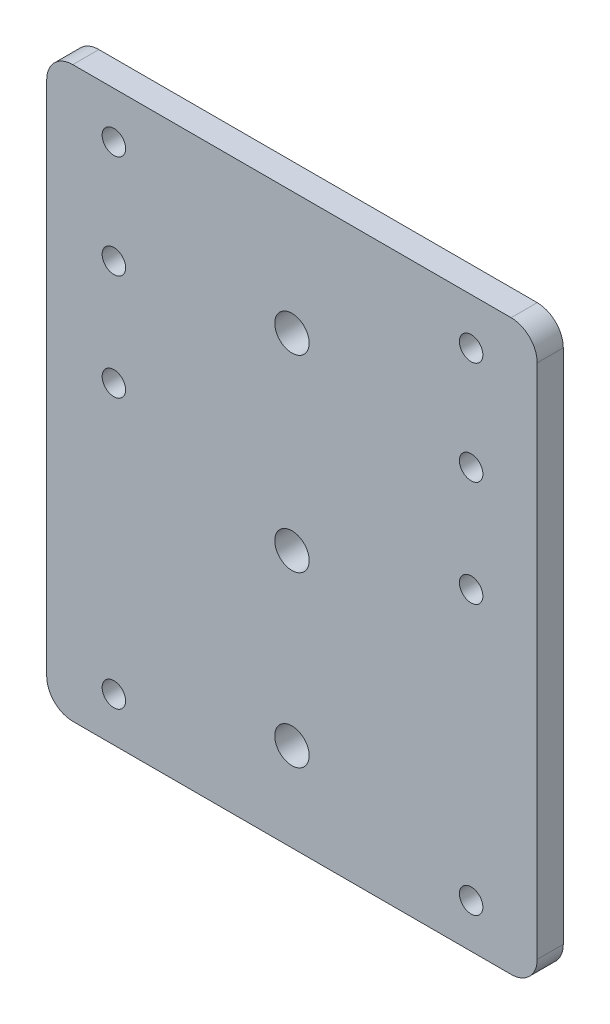
ISO-10303-21;
HEADER;
FILE_DESCRIPTION(('STEP AP214'),'2;1');
FILE_NAME('part.step','',(''),(''),'','','');
FILE_SCHEMA(('AUTOMOTIVE_DESIGN { 1 0 10303 214 1 1 1 1 }'));
ENDSEC;
DATA;
#1=APPLICATION_CONTEXT('core data for automotive mechanical design processes');
#2=APPLICATION_PROTOCOL_DEFINITION('international standard','automotive_design',2000,#1);
#3=PRODUCT_CONTEXT('',#1,'mechanical');
#4=PRODUCT('Part','Part','',(#3));
#5=PRODUCT_RELATED_PRODUCT_CATEGORY('part','',(#4));
#6=PRODUCT_DEFINITION_FORMATION('','',#4);
#7=PRODUCT_DEFINITION_CONTEXT('part definition',#1,'design');
#8=PRODUCT_DEFINITION('design','',#6,#7);
#9=PRODUCT_DEFINITION_SHAPE('','',#8);
#10=(LENGTH_UNIT() NAMED_UNIT(*) SI_UNIT(.MILLI.,.METRE.));
#11=(NAMED_UNIT(*) PLANE_ANGLE_UNIT() SI_UNIT($,.RADIAN.));
#12=(NAMED_UNIT(*) SI_UNIT($,.STERADIAN.) SOLID_ANGLE_UNIT());
#13=UNCERTAINTY_MEASURE_WITH_UNIT(LENGTH_MEASURE(1.E-05),#10,'distance_accuracy_value','');
#14=(GEOMETRIC_REPRESENTATION_CONTEXT(3) GLOBAL_UNCERTAINTY_ASSIGNED_CONTEXT((#13)) GLOBAL_UNIT_ASSIGNED_CONTEXT((#10,
#11,#12)) REPRESENTATION_CONTEXT('',''));
#15=CARTESIAN_POINT('',(0.,0.,0.));
#16=DIRECTION('',(0.,0.,1.));
#17=DIRECTION('',(1.,0.,0.));
#18=AXIS2_PLACEMENT_3D('',#15,#16,#17);
#19=CARTESIAN_POINT('',(42.,-49.5,5.));
#20=DIRECTION('',(0.,0.,-1.));
#21=DIRECTION('',(-1.,0.,0.));
#22=AXIS2_PLACEMENT_3D('',#19,#20,#21);
#23=CYLINDRICAL_SURFACE('',#22,5.);
#24=CARTESIAN_POINT('',(42.,-49.5,0.));
#25=DIRECTION('',(0.,0.,1.));
#26=DIRECTION('',(1.,0.,0.));
#27=AXIS2_PLACEMENT_3D('',#24,#25,#26);
#28=CIRCLE('',#27,5.);
#29=CARTESIAN_POINT('',(42.,-54.5,0.));
#30=VERTEX_POINT('',#29);
#31=CARTESIAN_POINT('',(47.,-49.5,0.));
#32=VERTEX_POINT('',#31);
#33=EDGE_CURVE('E129',#30,#32,#28,.T.);
#34=ORIENTED_EDGE('',*,*,#33,.T.);
#35=DIRECTION('',(0.,0.,-1.));
#36=VECTOR('',#35,1.);
#37=CARTESIAN_POINT('',(47.,-49.5,5.));
#38=LINE('',#37,#36);
#39=CARTESIAN_POINT('',(47.,-49.5,5.));
#40=VERTEX_POINT('',#39);
#41=EDGE_CURVE('E11',#40,#32,#38,.T.);
#42=ORIENTED_EDGE('',*,*,#41,.F.);
#43=CARTESIAN_POINT('',(42.,-49.5,5.));
#44=DIRECTION('',(0.,0.,1.));
#45=DIRECTION('',(1.,0.,0.));
#46=AXIS2_PLACEMENT_3D('',#43,#44,#45);
#47=CIRCLE('',#46,5.);
#48=CARTESIAN_POINT('',(42.,-54.5,5.));
#49=VERTEX_POINT('',#48);
#50=EDGE_CURVE('E144',#49,#40,#47,.T.);
#51=ORIENTED_EDGE('',*,*,#50,.F.);
#52=DIRECTION('',(0.,0.,-1.));
#53=VECTOR('',#52,1.);
#54=CARTESIAN_POINT('',(42.,-54.5,5.));
#55=LINE('',#54,#53);
#56=EDGE_CURVE('E125',#49,#30,#55,.T.);
#57=ORIENTED_EDGE('',*,*,#56,.T.);
#58=EDGE_LOOP('',(#34,#42,#51,#57));
#59=FACE_BOUND('',#58,.T.);
#60=ADVANCED_FACE('F33',(#59),#23,.T.);
#61=CARTESIAN_POINT('',(47.,49.5,5.));
#62=DIRECTION('',(-1.,0.,0.));
#63=DIRECTION('',(0.,0.,1.));
#64=AXIS2_PLACEMENT_3D('',#61,#62,#63);
#65=PLANE('',#64);
#66=DIRECTION('',(0.,1.,0.));
#67=VECTOR('',#66,1.);
#68=CARTESIAN_POINT('',(47.,49.5,0.));
#69=LINE('',#68,#67);
#70=CARTESIAN_POINT('',(47.,49.5,0.));
#71=VERTEX_POINT('',#70);
#72=EDGE_CURVE('E132',#32,#71,#69,.T.);
#73=ORIENTED_EDGE('',*,*,#72,.T.);
#74=DIRECTION('',(0.,0.,-1.));
#75=VECTOR('',#74,1.);
#76=CARTESIAN_POINT('',(47.,49.5,5.));
#77=LINE('',#76,#75);
#78=CARTESIAN_POINT('',(47.,49.5,5.));
#79=VERTEX_POINT('',#78);
#80=EDGE_CURVE('E41',#79,#71,#77,.T.);
#81=ORIENTED_EDGE('',*,*,#80,.F.);
#82=DIRECTION('',(0.,1.,0.));
#83=VECTOR('',#82,1.);
#84=CARTESIAN_POINT('',(47.,49.5,5.));
#85=LINE('',#84,#83);
#86=EDGE_CURVE('E92',#40,#79,#85,.T.);
#87=ORIENTED_EDGE('',*,*,#86,.F.);
#88=ORIENTED_EDGE('',*,*,#41,.T.);
#89=EDGE_LOOP('',(#73,#81,#87,#88));
#90=FACE_BOUND('',#89,.T.);
#91=ADVANCED_FACE('F286',(#90),#65,.F.);
#92=CARTESIAN_POINT('',(42.,49.5,5.));
#93=DIRECTION('',(0.,0.,-1.));
#94=DIRECTION('',(-1.,0.,0.));
#95=AXIS2_PLACEMENT_3D('',#92,#93,#94);
#96=CYLINDRICAL_SURFACE('',#95,5.);
#97=CARTESIAN_POINT('',(42.,49.5,0.));
#98=DIRECTION('',(0.,0.,1.));
#99=DIRECTION('',(1.,0.,0.));
#100=AXIS2_PLACEMENT_3D('',#97,#98,#99);
#101=CIRCLE('',#100,5.);
#102=CARTESIAN_POINT('',(42.,54.5,0.));
#103=VERTEX_POINT('',#102);
#104=EDGE_CURVE('E135',#71,#103,#101,.T.);
#105=ORIENTED_EDGE('',*,*,#104,.T.);
#106=DIRECTION('',(0.,0.,-1.));
#107=VECTOR('',#106,1.);
#108=CARTESIAN_POINT('',(42.,54.5,5.));
#109=LINE('',#108,#107);
#110=CARTESIAN_POINT('',(42.,54.5,5.));
#111=VERTEX_POINT('',#110);
#112=EDGE_CURVE('E151',#111,#103,#109,.T.);
#113=ORIENTED_EDGE('',*,*,#112,.F.);
#114=CARTESIAN_POINT('',(42.,49.5,5.));
#115=DIRECTION('',(0.,0.,1.));
#116=DIRECTION('',(1.,0.,0.));
#117=AXIS2_PLACEMENT_3D('',#114,#115,#116);
#118=CIRCLE('',#117,5.);
#119=EDGE_CURVE('E159',#79,#111,#118,.T.);
#120=ORIENTED_EDGE('',*,*,#119,.F.);
#121=ORIENTED_EDGE('',*,*,#80,.T.);
#122=EDGE_LOOP('',(#105,#113,#120,#121));
#123=FACE_BOUND('',#122,.T.);
#124=ADVANCED_FACE('F157',(#123),#96,.T.);
#125=CARTESIAN_POINT('',(-42.,54.5,5.));
#126=DIRECTION('',(0.,-1.,0.));
#127=DIRECTION('',(0.,0.,-1.));
#128=AXIS2_PLACEMENT_3D('',#125,#126,#127);
#129=PLANE('',#128);
#130=DIRECTION('',(-1.,0.,0.));
#131=VECTOR('',#130,1.);
#132=CARTESIAN_POINT('',(-42.,54.5,0.));
#133=LINE('',#132,#131);
#134=CARTESIAN_POINT('',(-42.,54.5,0.));
#135=VERTEX_POINT('',#134);
#136=EDGE_CURVE('E137',#103,#135,#133,.T.);
#137=ORIENTED_EDGE('',*,*,#136,.T.);
#138=DIRECTION('',(0.,0.,-1.));
#139=VECTOR('',#138,1.);
#140=CARTESIAN_POINT('',(-42.,54.5,5.));
#141=LINE('',#140,#139);
#142=CARTESIAN_POINT('',(-42.,54.5,5.));
#143=VERTEX_POINT('',#142);
#144=EDGE_CURVE('E148',#143,#135,#141,.T.);
#145=ORIENTED_EDGE('',*,*,#144,.F.);
#146=DIRECTION('',(-1.,0.,0.));
#147=VECTOR('',#146,1.);
#148=CARTESIAN_POINT('',(-42.,54.5,5.));
#149=LINE('',#148,#147);
#150=EDGE_CURVE('E171',#111,#143,#149,.T.);
#151=ORIENTED_EDGE('',*,*,#150,.F.);
#152=ORIENTED_EDGE('',*,*,#112,.T.);
#153=EDGE_LOOP('',(#137,#145,#151,#152));
#154=FACE_BOUND('',#153,.T.);
#155=ADVANCED_FACE('F167',(#154),#129,.F.);
#156=CARTESIAN_POINT('',(-42.,49.5,5.));
#157=DIRECTION('',(0.,0.,-1.));
#158=DIRECTION('',(-1.,0.,0.));
#159=AXIS2_PLACEMENT_3D('',#156,#157,#158);
#160=CYLINDRICAL_SURFACE('',#159,5.);
#161=CARTESIAN_POINT('',(-42.,49.5,0.));
#162=DIRECTION('',(0.,0.,1.));
#163=DIRECTION('',(-1.,0.,0.));
#164=AXIS2_PLACEMENT_3D('',#161,#162,#163);
#165=CIRCLE('',#164,5.);
#166=CARTESIAN_POINT('',(-47.,49.5,0.));
#167=VERTEX_POINT('',#166);
#168=EDGE_CURVE('E139',#135,#167,#165,.T.);
#169=ORIENTED_EDGE('',*,*,#168,.T.);
#170=DIRECTION('',(0.,0.,-1.));
#171=VECTOR('',#170,1.);
#172=CARTESIAN_POINT('',(-47.,49.5,5.));
#173=LINE('',#172,#171);
#174=CARTESIAN_POINT('',(-47.,49.5,5.));
#175=VERTEX_POINT('',#174);
#176=EDGE_CURVE('E120',#175,#167,#173,.T.);
#177=ORIENTED_EDGE('',*,*,#176,.F.);
#178=CARTESIAN_POINT('',(-42.,49.5,5.));
#179=DIRECTION('',(0.,0.,1.));
#180=DIRECTION('',(-1.,0.,0.));
#181=AXIS2_PLACEMENT_3D('',#178,#179,#180);
#182=CIRCLE('',#181,5.);
#183=EDGE_CURVE('E111',#143,#175,#182,.T.);
#184=ORIENTED_EDGE('',*,*,#183,.F.);
#185=ORIENTED_EDGE('',*,*,#144,.T.);
#186=EDGE_LOOP('',(#169,#177,#184,#185));
#187=FACE_BOUND('',#186,.T.);
#188=ADVANCED_FACE('F170',(#187),#160,.T.);
#189=CARTESIAN_POINT('',(-47.,49.5,5.));
#190=DIRECTION('',(1.,0.,0.));
#191=DIRECTION('',(0.,0.,-1.));
#192=AXIS2_PLACEMENT_3D('',#189,#190,#191);
#193=PLANE('',#192);
#194=DIRECTION('',(0.,-1.,0.));
#195=VECTOR('',#194,1.);
#196=CARTESIAN_POINT('',(-47.,49.5,0.));
#197=LINE('',#196,#195);
#198=CARTESIAN_POINT('',(-47.,-49.5,0.));
#199=VERTEX_POINT('',#198);
#200=EDGE_CURVE('E119',#167,#199,#197,.T.);
#201=ORIENTED_EDGE('',*,*,#200,.T.);
#202=DIRECTION('',(0.,0.,-1.));
#203=VECTOR('',#202,1.);
#204=CARTESIAN_POINT('',(-47.,-49.5,5.));
#205=LINE('',#204,#203);
#206=CARTESIAN_POINT('',(-47.,-49.5,5.));
#207=VERTEX_POINT('',#206);
#208=EDGE_CURVE('E116',#207,#199,#205,.T.);
#209=ORIENTED_EDGE('',*,*,#208,.F.);
#210=DIRECTION('',(0.,-1.,0.));
#211=VECTOR('',#210,1.);
#212=CARTESIAN_POINT('',(-47.,49.5,5.));
#213=LINE('',#212,#211);
#214=EDGE_CURVE('E105',#175,#207,#213,.T.);
#215=ORIENTED_EDGE('',*,*,#214,.F.);
#216=ORIENTED_EDGE('',*,*,#176,.T.);
#217=EDGE_LOOP('',(#201,#209,#215,#216));
#218=FACE_BOUND('',#217,.T.);
#219=ADVANCED_FACE('F117',(#218),#193,.F.);
#220=CARTESIAN_POINT('',(-42.,-49.5,5.));
#221=DIRECTION('',(0.,0.,-1.));
#222=DIRECTION('',(-1.,0.,0.));
#223=AXIS2_PLACEMENT_3D('',#220,#221,#222);
#224=CYLINDRICAL_SURFACE('',#223,5.);
#225=CARTESIAN_POINT('',(-42.,-49.5,0.));
#226=DIRECTION('',(0.,0.,1.));
#227=DIRECTION('',(-1.,0.,0.));
#228=AXIS2_PLACEMENT_3D('',#225,#226,#227);
#229=CIRCLE('',#228,5.);
#230=CARTESIAN_POINT('',(-42.,-54.5,0.));
#231=VERTEX_POINT('',#230);
#232=EDGE_CURVE('E78',#199,#231,#229,.T.);
#233=ORIENTED_EDGE('',*,*,#232,.T.);
#234=DIRECTION('',(0.,0.,-1.));
#235=VECTOR('',#234,1.);
#236=CARTESIAN_POINT('',(-42.,-54.5,5.));
#237=LINE('',#236,#235);
#238=CARTESIAN_POINT('',(-42.,-54.5,5.));
#239=VERTEX_POINT('',#238);
#240=EDGE_CURVE('E121',#239,#231,#237,.T.);
#241=ORIENTED_EDGE('',*,*,#240,.F.);
#242=CARTESIAN_POINT('',(-42.,-49.5,5.));
#243=DIRECTION('',(0.,0.,1.));
#244=DIRECTION('',(-1.,0.,0.));
#245=AXIS2_PLACEMENT_3D('',#242,#243,#244);
#246=CIRCLE('',#245,5.);
#247=EDGE_CURVE('E109',#207,#239,#246,.T.);
#248=ORIENTED_EDGE('',*,*,#247,.F.);
#249=ORIENTED_EDGE('',*,*,#208,.T.);
#250=EDGE_LOOP('',(#233,#241,#248,#249));
#251=FACE_BOUND('',#250,.T.);
#252=ADVANCED_FACE('F123',(#251),#224,.T.);
#253=CARTESIAN_POINT('',(-42.,-54.5,5.));
#254=DIRECTION('',(0.,1.,0.));
#255=DIRECTION('',(0.,0.,1.));
#256=AXIS2_PLACEMENT_3D('',#253,#254,#255);
#257=PLANE('',#256);
#258=DIRECTION('',(1.,0.,0.));
#259=VECTOR('',#258,1.);
#260=CARTESIAN_POINT('',(-42.,-54.5,0.));
#261=LINE('',#260,#259);
#262=EDGE_CURVE('E84',#231,#30,#261,.T.);
#263=ORIENTED_EDGE('',*,*,#262,.T.);
#264=ORIENTED_EDGE('',*,*,#56,.F.);
#265=DIRECTION('',(1.,0.,0.));
#266=VECTOR('',#265,1.);
#267=CARTESIAN_POINT('',(-42.,-54.5,5.));
#268=LINE('',#267,#266);
#269=EDGE_CURVE('E49',#239,#49,#268,.T.);
#270=ORIENTED_EDGE('',*,*,#269,.F.);
#271=ORIENTED_EDGE('',*,*,#240,.T.);
#272=EDGE_LOOP('',(#263,#264,#270,#271));
#273=FACE_BOUND('',#272,.T.);
#274=ADVANCED_FACE('F247',(#273),#257,.F.);
#275=CARTESIAN_POINT('',(42.,-49.5,5.));
#276=DIRECTION('',(0.,0.,1.));
#277=DIRECTION('',(1.,0.,0.));
#278=AXIS2_PLACEMENT_3D('',#275,#276,#277);
#279=PLANE('',#278);
#280=CARTESIAN_POINT('',(34.3362399687752,45.6113012959385,5.));
#281=DIRECTION('',(0.,0.,1.));
#282=DIRECTION('',(1.,0.,0.));
#283=AXIS2_PLACEMENT_3D('',#280,#281,#282);
#284=CIRCLE('',#283,2.25);
#285=CARTESIAN_POINT('',(36.5862399687752,45.6113012959385,5.));
#286=VERTEX_POINT('',#285);
#287=EDGE_CURVE('E239',#286,#286,#284,.T.);
#288=ORIENTED_EDGE('',*,*,#287,.F.);
#289=EDGE_LOOP('',(#288));
#290=FACE_BOUND('',#289,.T.);
#291=CARTESIAN_POINT('',(34.3362399687752,25.8445482428158,5.));
#292=DIRECTION('',(0.,0.,1.));
#293=DIRECTION('',(1.,0.,0.));
#294=AXIS2_PLACEMENT_3D('',#291,#292,#293);
#295=CIRCLE('',#294,2.25);
#296=CARTESIAN_POINT('',(36.5862399687752,25.8445482428158,5.));
#297=VERTEX_POINT('',#296);
#298=EDGE_CURVE('E233',#297,#297,#295,.T.);
#299=ORIENTED_EDGE('',*,*,#298,.F.);
#300=EDGE_LOOP('',(#299));
#301=FACE_BOUND('',#300,.T.);
#302=CARTESIAN_POINT('',(34.3362399687752,5.57268181087611,5.));
#303=DIRECTION('',(0.,0.,1.));
#304=DIRECTION('',(1.,0.,0.));
#305=AXIS2_PLACEMENT_3D('',#302,#303,#304);
#306=CIRCLE('',#305,2.25);
#307=CARTESIAN_POINT('',(36.5862399687752,5.57268181087611,5.));
#308=VERTEX_POINT('',#307);
#309=EDGE_CURVE('E227',#308,#308,#306,.T.);
#310=ORIENTED_EDGE('',*,*,#309,.F.);
#311=EDGE_LOOP('',(#310));
#312=FACE_BOUND('',#311,.T.);
#313=CARTESIAN_POINT('',(34.3362399687752,-46.0462193347881,5.));
#314=DIRECTION('',(0.,0.,1.));
#315=DIRECTION('',(1.,0.,0.));
#316=AXIS2_PLACEMENT_3D('',#313,#314,#315);
#317=CIRCLE('',#316,2.25);
#318=CARTESIAN_POINT('',(36.5862399687752,-46.0462193347881,5.));
#319=VERTEX_POINT('',#318);
#320=EDGE_CURVE('E221',#319,#319,#317,.T.);
#321=ORIENTED_EDGE('',*,*,#320,.F.);
#322=EDGE_LOOP('',(#321));
#323=FACE_BOUND('',#322,.T.);
#324=CARTESIAN_POINT('',(-34.1251502546722,-46.0462193347881,5.));
#325=DIRECTION('',(0.,0.,1.));
#326=DIRECTION('',(1.,0.,0.));
#327=AXIS2_PLACEMENT_3D('',#324,#325,#326);
#328=CIRCLE('',#327,2.25);
#329=CARTESIAN_POINT('',(-31.8751502546722,-46.0462193347881,5.));
#330=VERTEX_POINT('',#329);
#331=EDGE_CURVE('E215',#330,#330,#328,.T.);
#332=ORIENTED_EDGE('',*,*,#331,.F.);
#333=EDGE_LOOP('',(#332));
#334=FACE_BOUND('',#333,.T.);
#335=CARTESIAN_POINT('',(-34.1251502546722,5.57268181087611,5.));
#336=DIRECTION('',(0.,0.,1.));
#337=DIRECTION('',(1.,0.,0.));
#338=AXIS2_PLACEMENT_3D('',#335,#336,#337);
#339=CIRCLE('',#338,2.25);
#340=CARTESIAN_POINT('',(-31.8751502546722,5.57268181087611,5.));
#341=VERTEX_POINT('',#340);
#342=EDGE_CURVE('E209',#341,#341,#339,.T.);
#343=ORIENTED_EDGE('',*,*,#342,.F.);
#344=EDGE_LOOP('',(#343));
#345=FACE_BOUND('',#344,.T.);
#346=CARTESIAN_POINT('',(-34.1251502546722,25.8445482428158,5.));
#347=DIRECTION('',(0.,0.,1.));
#348=DIRECTION('',(1.,0.,0.));
#349=AXIS2_PLACEMENT_3D('',#346,#347,#348);
#350=CIRCLE('',#349,2.25);
#351=CARTESIAN_POINT('',(-31.8751502546722,25.8445482428158,5.));
#352=VERTEX_POINT('',#351);
#353=EDGE_CURVE('E203',#352,#352,#350,.T.);
#354=ORIENTED_EDGE('',*,*,#353,.F.);
#355=EDGE_LOOP('',(#354));
#356=FACE_BOUND('',#355,.T.);
#357=CARTESIAN_POINT('',(-34.1251502546722,45.6113012959385,5.));
#358=DIRECTION('',(0.,0.,1.));
#359=DIRECTION('',(1.,0.,0.));
#360=AXIS2_PLACEMENT_3D('',#357,#358,#359);
#361=CIRCLE('',#360,2.25);
#362=CARTESIAN_POINT('',(-31.8751502546722,45.6113012959385,5.));
#363=VERTEX_POINT('',#362);
#364=EDGE_CURVE('E197',#363,#363,#361,.T.);
#365=ORIENTED_EDGE('',*,*,#364,.F.);
#366=EDGE_LOOP('',(#365));
#367=FACE_BOUND('',#366,.T.);
#368=CARTESIAN_POINT('',(0.,30.9294111484206,5.));
#369=DIRECTION('',(0.,0.,1.));
#370=DIRECTION('',(1.,0.,0.));
#371=AXIS2_PLACEMENT_3D('',#368,#369,#370);
#372=CIRCLE('',#371,3.3);
#373=CARTESIAN_POINT('',(3.3,30.9294111484206,5.));
#374=VERTEX_POINT('',#373);
#375=EDGE_CURVE('E191',#374,#374,#372,.T.);
#376=ORIENTED_EDGE('',*,*,#375,.F.);
#377=EDGE_LOOP('',(#376));
#378=FACE_BOUND('',#377,.T.);
#379=CARTESIAN_POINT('',(0.,-37.5449920416884,5.));
#380=DIRECTION('',(0.,0.,1.));
#381=DIRECTION('',(1.,0.,0.));
#382=AXIS2_PLACEMENT_3D('',#379,#380,#381);
#383=CIRCLE('',#382,3.3);
#384=CARTESIAN_POINT('',(3.3,-37.5449920416884,5.));
#385=VERTEX_POINT('',#384);
#386=EDGE_CURVE('E185',#385,#385,#383,.T.);
#387=ORIENTED_EDGE('',*,*,#386,.F.);
#388=EDGE_LOOP('',(#387));
#389=FACE_BOUND('',#388,.T.);
#390=CARTESIAN_POINT('',(0.,-5.15832987953502,5.));
#391=DIRECTION('',(0.,0.,1.));
#392=DIRECTION('',(1.,0.,0.));
#393=AXIS2_PLACEMENT_3D('',#390,#391,#392);
#394=CIRCLE('',#393,3.3);
#395=CARTESIAN_POINT('',(3.3,-5.15832987953502,5.));
#396=VERTEX_POINT('',#395);
#397=EDGE_CURVE('E179',#396,#396,#394,.T.);
#398=ORIENTED_EDGE('',*,*,#397,.F.);
#399=EDGE_LOOP('',(#398));
#400=FACE_BOUND('',#399,.T.);
#401=ORIENTED_EDGE('',*,*,#50,.T.);
#402=ORIENTED_EDGE('',*,*,#86,.T.);
#403=ORIENTED_EDGE('',*,*,#119,.T.);
#404=ORIENTED_EDGE('',*,*,#150,.T.);
#405=ORIENTED_EDGE('',*,*,#183,.T.);
#406=ORIENTED_EDGE('',*,*,#214,.T.);
#407=ORIENTED_EDGE('',*,*,#247,.T.);
#408=ORIENTED_EDGE('',*,*,#269,.T.);
#409=EDGE_LOOP('',(#401,#402,#403,#404,#405,#406,#407,#408));
#410=FACE_BOUND('',#409,.T.);
#411=ADVANCED_FACE('F107',(#290,#301,#312,#323,#334,#345,#356,#367,#378,#389,#400,#410),#279,.T.);
#412=CARTESIAN_POINT('',(42.,-49.5,0.));
#413=DIRECTION('',(0.,0.,1.));
#414=DIRECTION('',(1.,0.,0.));
#415=AXIS2_PLACEMENT_3D('',#412,#413,#414);
#416=PLANE('',#415);
#417=CARTESIAN_POINT('',(34.3362399687752,45.6113012959385,0.));
#418=DIRECTION('',(0.,0.,1.));
#419=DIRECTION('',(1.,0.,0.));
#420=AXIS2_PLACEMENT_3D('',#417,#418,#419);
#421=CIRCLE('',#420,2.25);
#422=CARTESIAN_POINT('',(36.5862399687752,45.6113012959385,0.));
#423=VERTEX_POINT('',#422);
#424=EDGE_CURVE('E236',#423,#423,#421,.T.);
#425=ORIENTED_EDGE('',*,*,#424,.T.);
#426=EDGE_LOOP('',(#425));
#427=FACE_BOUND('',#426,.T.);
#428=CARTESIAN_POINT('',(34.3362399687752,25.8445482428158,0.));
#429=DIRECTION('',(0.,0.,1.));
#430=DIRECTION('',(1.,0.,0.));
#431=AXIS2_PLACEMENT_3D('',#428,#429,#430);
#432=CIRCLE('',#431,2.25);
#433=CARTESIAN_POINT('',(36.5862399687752,25.8445482428158,0.));
#434=VERTEX_POINT('',#433);
#435=EDGE_CURVE('E230',#434,#434,#432,.T.);
#436=ORIENTED_EDGE('',*,*,#435,.T.);
#437=EDGE_LOOP('',(#436));
#438=FACE_BOUND('',#437,.T.);
#439=CARTESIAN_POINT('',(34.3362399687752,5.57268181087611,0.));
#440=DIRECTION('',(0.,0.,1.));
#441=DIRECTION('',(1.,0.,0.));
#442=AXIS2_PLACEMENT_3D('',#439,#440,#441);
#443=CIRCLE('',#442,2.25);
#444=CARTESIAN_POINT('',(36.5862399687752,5.57268181087611,0.));
#445=VERTEX_POINT('',#444);
#446=EDGE_CURVE('E224',#445,#445,#443,.T.);
#447=ORIENTED_EDGE('',*,*,#446,.T.);
#448=EDGE_LOOP('',(#447));
#449=FACE_BOUND('',#448,.T.);
#450=CARTESIAN_POINT('',(34.3362399687752,-46.0462193347881,0.));
#451=DIRECTION('',(0.,0.,1.));
#452=DIRECTION('',(1.,0.,0.));
#453=AXIS2_PLACEMENT_3D('',#450,#451,#452);
#454=CIRCLE('',#453,2.25);
#455=CARTESIAN_POINT('',(36.5862399687752,-46.0462193347881,0.));
#456=VERTEX_POINT('',#455);
#457=EDGE_CURVE('E218',#456,#456,#454,.T.);
#458=ORIENTED_EDGE('',*,*,#457,.T.);
#459=EDGE_LOOP('',(#458));
#460=FACE_BOUND('',#459,.T.);
#461=CARTESIAN_POINT('',(-34.1251502546722,-46.0462193347881,0.));
#462=DIRECTION('',(0.,0.,1.));
#463=DIRECTION('',(1.,0.,0.));
#464=AXIS2_PLACEMENT_3D('',#461,#462,#463);
#465=CIRCLE('',#464,2.25);
#466=CARTESIAN_POINT('',(-31.8751502546722,-46.0462193347881,0.));
#467=VERTEX_POINT('',#466);
#468=EDGE_CURVE('E212',#467,#467,#465,.T.);
#469=ORIENTED_EDGE('',*,*,#468,.T.);
#470=EDGE_LOOP('',(#469));
#471=FACE_BOUND('',#470,.T.);
#472=CARTESIAN_POINT('',(-34.1251502546722,5.57268181087611,0.));
#473=DIRECTION('',(0.,0.,1.));
#474=DIRECTION('',(1.,0.,0.));
#475=AXIS2_PLACEMENT_3D('',#472,#473,#474);
#476=CIRCLE('',#475,2.25);
#477=CARTESIAN_POINT('',(-31.8751502546722,5.57268181087611,0.));
#478=VERTEX_POINT('',#477);
#479=EDGE_CURVE('E206',#478,#478,#476,.T.);
#480=ORIENTED_EDGE('',*,*,#479,.T.);
#481=EDGE_LOOP('',(#480));
#482=FACE_BOUND('',#481,.T.);
#483=CARTESIAN_POINT('',(-34.1251502546722,25.8445482428158,0.));
#484=DIRECTION('',(0.,0.,1.));
#485=DIRECTION('',(1.,0.,0.));
#486=AXIS2_PLACEMENT_3D('',#483,#484,#485);
#487=CIRCLE('',#486,2.25);
#488=CARTESIAN_POINT('',(-31.8751502546722,25.8445482428158,0.));
#489=VERTEX_POINT('',#488);
#490=EDGE_CURVE('E200',#489,#489,#487,.T.);
#491=ORIENTED_EDGE('',*,*,#490,.T.);
#492=EDGE_LOOP('',(#491));
#493=FACE_BOUND('',#492,.T.);
#494=CARTESIAN_POINT('',(-34.1251502546722,45.6113012959385,0.));
#495=DIRECTION('',(0.,0.,1.));
#496=DIRECTION('',(1.,0.,0.));
#497=AXIS2_PLACEMENT_3D('',#494,#495,#496);
#498=CIRCLE('',#497,2.25);
#499=CARTESIAN_POINT('',(-31.8751502546722,45.6113012959385,0.));
#500=VERTEX_POINT('',#499);
#501=EDGE_CURVE('E194',#500,#500,#498,.T.);
#502=ORIENTED_EDGE('',*,*,#501,.T.);
#503=EDGE_LOOP('',(#502));
#504=FACE_BOUND('',#503,.T.);
#505=CARTESIAN_POINT('',(0.,30.9294111484206,0.));
#506=DIRECTION('',(0.,0.,1.));
#507=DIRECTION('',(1.,0.,0.));
#508=AXIS2_PLACEMENT_3D('',#505,#506,#507);
#509=CIRCLE('',#508,3.3);
#510=CARTESIAN_POINT('',(3.3,30.9294111484206,0.));
#511=VERTEX_POINT('',#510);
#512=EDGE_CURVE('E188',#511,#511,#509,.T.);
#513=ORIENTED_EDGE('',*,*,#512,.T.);
#514=EDGE_LOOP('',(#513));
#515=FACE_BOUND('',#514,.T.);
#516=CARTESIAN_POINT('',(0.,-37.5449920416884,0.));
#517=DIRECTION('',(0.,0.,1.));
#518=DIRECTION('',(1.,0.,0.));
#519=AXIS2_PLACEMENT_3D('',#516,#517,#518);
#520=CIRCLE('',#519,3.3);
#521=CARTESIAN_POINT('',(3.3,-37.5449920416884,0.));
#522=VERTEX_POINT('',#521);
#523=EDGE_CURVE('E182',#522,#522,#520,.T.);
#524=ORIENTED_EDGE('',*,*,#523,.T.);
#525=EDGE_LOOP('',(#524));
#526=FACE_BOUND('',#525,.T.);
#527=CARTESIAN_POINT('',(0.,-5.15832987953502,0.));
#528=DIRECTION('',(0.,0.,1.));
#529=DIRECTION('',(1.,0.,0.));
#530=AXIS2_PLACEMENT_3D('',#527,#528,#529);
#531=CIRCLE('',#530,3.3);
#532=CARTESIAN_POINT('',(3.3,-5.15832987953502,0.));
#533=VERTEX_POINT('',#532);
#534=EDGE_CURVE('E133',#533,#533,#531,.T.);
#535=ORIENTED_EDGE('',*,*,#534,.T.);
#536=EDGE_LOOP('',(#535));
#537=FACE_BOUND('',#536,.T.);
#538=ORIENTED_EDGE('',*,*,#33,.F.);
#539=ORIENTED_EDGE('',*,*,#262,.F.);
#540=ORIENTED_EDGE('',*,*,#232,.F.);
#541=ORIENTED_EDGE('',*,*,#200,.F.);
#542=ORIENTED_EDGE('',*,*,#168,.F.);
#543=ORIENTED_EDGE('',*,*,#136,.F.);
#544=ORIENTED_EDGE('',*,*,#104,.F.);
#545=ORIENTED_EDGE('',*,*,#72,.F.);
#546=EDGE_LOOP('',(#538,#539,#540,#541,#542,#543,#544,#545));
#547=FACE_BOUND('',#546,.T.);
#548=ADVANCED_FACE('F163',(#427,#438,#449,#460,#471,#482,#493,#504,#515,#526,#537,#547),#416,.F.);
#549=CARTESIAN_POINT('',(0.,-5.15832987953502,5.));
#550=DIRECTION('',(0.,0.,1.));
#551=DIRECTION('',(1.,0.,0.));
#552=AXIS2_PLACEMENT_3D('',#549,#550,#551);
#553=CYLINDRICAL_SURFACE('',#552,3.3);
#554=ORIENTED_EDGE('',*,*,#534,.F.);
#555=EDGE_LOOP('',(#554));
#556=FACE_BOUND('',#555,.T.);
#557=ORIENTED_EDGE('',*,*,#397,.T.);
#558=EDGE_LOOP('',(#557));
#559=FACE_BOUND('',#558,.T.);
#560=ADVANCED_FACE('F269',(#556,#559),#553,.F.);
#561=CARTESIAN_POINT('',(0.,-37.5449920416884,5.));
#562=DIRECTION('',(0.,0.,1.));
#563=DIRECTION('',(1.,0.,0.));
#564=AXIS2_PLACEMENT_3D('',#561,#562,#563);
#565=CYLINDRICAL_SURFACE('',#564,3.3);
#566=ORIENTED_EDGE('',*,*,#523,.F.);
#567=EDGE_LOOP('',(#566));
#568=FACE_BOUND('',#567,.T.);
#569=ORIENTED_EDGE('',*,*,#386,.T.);
#570=EDGE_LOOP('',(#569));
#571=FACE_BOUND('',#570,.T.);
#572=ADVANCED_FACE('F271',(#568,#571),#565,.F.);
#573=CARTESIAN_POINT('',(0.,30.9294111484206,5.));
#574=DIRECTION('',(0.,0.,1.));
#575=DIRECTION('',(1.,0.,0.));
#576=AXIS2_PLACEMENT_3D('',#573,#574,#575);
#577=CYLINDRICAL_SURFACE('',#576,3.3);
#578=ORIENTED_EDGE('',*,*,#512,.F.);
#579=EDGE_LOOP('',(#578));
#580=FACE_BOUND('',#579,.T.);
#581=ORIENTED_EDGE('',*,*,#375,.T.);
#582=EDGE_LOOP('',(#581));
#583=FACE_BOUND('',#582,.T.);
#584=ADVANCED_FACE('F278',(#580,#583),#577,.F.);
#585=CARTESIAN_POINT('',(-34.1251502546722,45.6113012959385,5.));
#586=DIRECTION('',(0.,0.,1.));
#587=DIRECTION('',(1.,0.,0.));
#588=AXIS2_PLACEMENT_3D('',#585,#586,#587);
#589=CYLINDRICAL_SURFACE('',#588,2.25);
#590=ORIENTED_EDGE('',*,*,#501,.F.);
#591=EDGE_LOOP('',(#590));
#592=FACE_BOUND('',#591,.T.);
#593=ORIENTED_EDGE('',*,*,#364,.T.);
#594=EDGE_LOOP('',(#593));
#595=FACE_BOUND('',#594,.T.);
#596=ADVANCED_FACE('F352',(#592,#595),#589,.F.);
#597=CARTESIAN_POINT('',(-34.1251502546722,25.8445482428158,5.));
#598=DIRECTION('',(0.,0.,1.));
#599=DIRECTION('',(1.,0.,0.));
#600=AXIS2_PLACEMENT_3D('',#597,#598,#599);
#601=CYLINDRICAL_SURFACE('',#600,2.25);
#602=ORIENTED_EDGE('',*,*,#490,.F.);
#603=EDGE_LOOP('',(#602));
#604=FACE_BOUND('',#603,.T.);
#605=ORIENTED_EDGE('',*,*,#353,.T.);
#606=EDGE_LOOP('',(#605));
#607=FACE_BOUND('',#606,.T.);
#608=ADVANCED_FACE('F367',(#604,#607),#601,.F.);
#609=CARTESIAN_POINT('',(-34.1251502546722,5.57268181087611,5.));
#610=DIRECTION('',(0.,0.,1.));
#611=DIRECTION('',(1.,0.,0.));
#612=AXIS2_PLACEMENT_3D('',#609,#610,#611);
#613=CYLINDRICAL_SURFACE('',#612,2.25);
#614=ORIENTED_EDGE('',*,*,#479,.F.);
#615=EDGE_LOOP('',(#614));
#616=FACE_BOUND('',#615,.T.);
#617=ORIENTED_EDGE('',*,*,#342,.T.);
#618=EDGE_LOOP('',(#617));
#619=FACE_BOUND('',#618,.T.);
#620=ADVANCED_FACE('F377',(#616,#619),#613,.F.);
#621=CARTESIAN_POINT('',(-34.1251502546722,-46.0462193347881,5.));
#622=DIRECTION('',(0.,0.,1.));
#623=DIRECTION('',(1.,0.,0.));
#624=AXIS2_PLACEMENT_3D('',#621,#622,#623);
#625=CYLINDRICAL_SURFACE('',#624,2.25);
#626=ORIENTED_EDGE('',*,*,#468,.F.);
#627=EDGE_LOOP('',(#626));
#628=FACE_BOUND('',#627,.T.);
#629=ORIENTED_EDGE('',*,*,#331,.T.);
#630=EDGE_LOOP('',(#629));
#631=FACE_BOUND('',#630,.T.);
#632=ADVANCED_FACE('F387',(#628,#631),#625,.F.);
#633=CARTESIAN_POINT('',(34.3362399687752,-46.0462193347881,5.));
#634=DIRECTION('',(0.,0.,1.));
#635=DIRECTION('',(1.,0.,0.));
#636=AXIS2_PLACEMENT_3D('',#633,#634,#635);
#637=CYLINDRICAL_SURFACE('',#636,2.25);
#638=ORIENTED_EDGE('',*,*,#457,.F.);
#639=EDGE_LOOP('',(#638));
#640=FACE_BOUND('',#639,.T.);
#641=ORIENTED_EDGE('',*,*,#320,.T.);
#642=EDGE_LOOP('',(#641));
#643=FACE_BOUND('',#642,.T.);
#644=ADVANCED_FACE('F397',(#640,#643),#637,.F.);
#645=CARTESIAN_POINT('',(34.3362399687752,5.57268181087611,5.));
#646=DIRECTION('',(0.,0.,1.));
#647=DIRECTION('',(1.,0.,0.));
#648=AXIS2_PLACEMENT_3D('',#645,#646,#647);
#649=CYLINDRICAL_SURFACE('',#648,2.25);
#650=ORIENTED_EDGE('',*,*,#446,.F.);
#651=EDGE_LOOP('',(#650));
#652=FACE_BOUND('',#651,.T.);
#653=ORIENTED_EDGE('',*,*,#309,.T.);
#654=EDGE_LOOP('',(#653));
#655=FACE_BOUND('',#654,.T.);
#656=ADVANCED_FACE('F407',(#652,#655),#649,.F.);
#657=CARTESIAN_POINT('',(34.3362399687752,25.8445482428158,5.));
#658=DIRECTION('',(0.,0.,1.));
#659=DIRECTION('',(1.,0.,0.));
#660=AXIS2_PLACEMENT_3D('',#657,#658,#659);
#661=CYLINDRICAL_SURFACE('',#660,2.25);
#662=ORIENTED_EDGE('',*,*,#435,.F.);
#663=EDGE_LOOP('',(#662));
#664=FACE_BOUND('',#663,.T.);
#665=ORIENTED_EDGE('',*,*,#298,.T.);
#666=EDGE_LOOP('',(#665));
#667=FACE_BOUND('',#666,.T.);
#668=ADVANCED_FACE('F417',(#664,#667),#661,.F.);
#669=CARTESIAN_POINT('',(34.3362399687752,45.6113012959385,5.));
#670=DIRECTION('',(0.,0.,1.));
#671=DIRECTION('',(1.,0.,0.));
#672=AXIS2_PLACEMENT_3D('',#669,#670,#671);
#673=CYLINDRICAL_SURFACE('',#672,2.25);
#674=ORIENTED_EDGE('',*,*,#424,.F.);
#675=EDGE_LOOP('',(#674));
#676=FACE_BOUND('',#675,.T.);
#677=ORIENTED_EDGE('',*,*,#287,.T.);
#678=EDGE_LOOP('',(#677));
#679=FACE_BOUND('',#678,.T.);
#680=ADVANCED_FACE('F243',(#676,#679),#673,.F.);
#681=CLOSED_SHELL('',(#60,#91,#124,#155,#188,#219,#252,#274,#411,#548,#560,#572,#584,#596,#608,
#620,#632,#644,#656,#668,#680));
#682=MANIFOLD_SOLID_BREP('B2',#681);
#683=ADVANCED_BREP_SHAPE_REPRESENTATION('',(#18,#682),#14);
#684=SHAPE_DEFINITION_REPRESENTATION(#9,#683);
ENDSEC;
END-ISO-10303-21;
